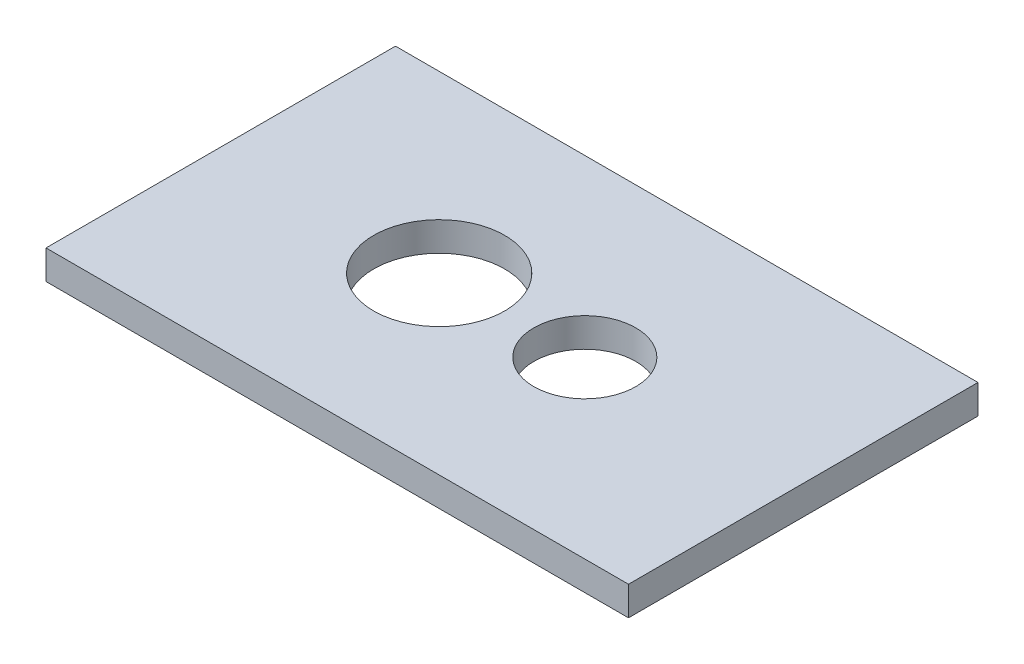
ISO-10303-21;
HEADER;
FILE_DESCRIPTION(('STEP AP214'),'2;1');
FILE_NAME('part.step','',(''),(''),'','','');
FILE_SCHEMA(('AUTOMOTIVE_DESIGN { 1 0 10303 214 1 1 1 1 }'));
ENDSEC;
DATA;
#1=APPLICATION_CONTEXT('core data for automotive mechanical design processes');
#2=APPLICATION_PROTOCOL_DEFINITION('international standard','automotive_design',2000,#1);
#3=PRODUCT_CONTEXT('',#1,'mechanical');
#4=PRODUCT('Part','Part','',(#3));
#5=PRODUCT_RELATED_PRODUCT_CATEGORY('part','',(#4));
#6=PRODUCT_DEFINITION_FORMATION('','',#4);
#7=PRODUCT_DEFINITION_CONTEXT('part definition',#1,'design');
#8=PRODUCT_DEFINITION('design','',#6,#7);
#9=PRODUCT_DEFINITION_SHAPE('','',#8);
#10=(LENGTH_UNIT() NAMED_UNIT(*) SI_UNIT(.MILLI.,.METRE.));
#11=(NAMED_UNIT(*) PLANE_ANGLE_UNIT() SI_UNIT($,.RADIAN.));
#12=(NAMED_UNIT(*) SI_UNIT($,.STERADIAN.) SOLID_ANGLE_UNIT());
#13=UNCERTAINTY_MEASURE_WITH_UNIT(LENGTH_MEASURE(1.E-05),#10,'distance_accuracy_value','');
#14=(GEOMETRIC_REPRESENTATION_CONTEXT(3) GLOBAL_UNCERTAINTY_ASSIGNED_CONTEXT((#13)) GLOBAL_UNIT_ASSIGNED_CONTEXT((#10,
#11,#12)) REPRESENTATION_CONTEXT('',''));
#15=CARTESIAN_POINT('',(0.,0.,0.));
#16=DIRECTION('',(0.,0.,1.));
#17=DIRECTION('',(1.,0.,0.));
#18=AXIS2_PLACEMENT_3D('',#15,#16,#17);
#19=CARTESIAN_POINT('',(63.5,6.35,38.1));
#20=DIRECTION('',(-1.,0.,0.));
#21=DIRECTION('',(0.,0.,1.));
#22=AXIS2_PLACEMENT_3D('',#19,#20,#21);
#23=PLANE('',#22);
#24=DIRECTION('',(0.,0.,-1.));
#25=VECTOR('',#24,1.);
#26=CARTESIAN_POINT('',(63.5,0.,38.1));
#27=LINE('',#26,#25);
#28=CARTESIAN_POINT('',(63.5,0.,38.1));
#29=VERTEX_POINT('',#28);
#30=CARTESIAN_POINT('',(63.5,0.,-38.1));
#31=VERTEX_POINT('',#30);
#32=EDGE_CURVE('E100',#29,#31,#27,.T.);
#33=ORIENTED_EDGE('',*,*,#32,.T.);
#34=DIRECTION('',(0.,-1.,0.));
#35=VECTOR('',#34,1.);
#36=CARTESIAN_POINT('',(63.5,6.35,-38.1));
#37=LINE('',#36,#35);
#38=CARTESIAN_POINT('',(63.5,6.35,-38.1));
#39=VERTEX_POINT('',#38);
#40=EDGE_CURVE('E11',#39,#31,#37,.T.);
#41=ORIENTED_EDGE('',*,*,#40,.F.);
#42=DIRECTION('',(0.,0.,-1.));
#43=VECTOR('',#42,1.);
#44=CARTESIAN_POINT('',(63.5,6.35,38.1));
#45=LINE('',#44,#43);
#46=CARTESIAN_POINT('',(63.5,6.35,38.1));
#47=VERTEX_POINT('',#46);
#48=EDGE_CURVE('E88',#47,#39,#45,.T.);
#49=ORIENTED_EDGE('',*,*,#48,.F.);
#50=DIRECTION('',(0.,-1.,0.));
#51=VECTOR('',#50,1.);
#52=CARTESIAN_POINT('',(63.5,6.35,38.1));
#53=LINE('',#52,#51);
#54=EDGE_CURVE('E96',#47,#29,#53,.T.);
#55=ORIENTED_EDGE('',*,*,#54,.T.);
#56=EDGE_LOOP('',(#33,#41,#49,#55));
#57=FACE_BOUND('',#56,.T.);
#58=ADVANCED_FACE('F37',(#57),#23,.F.);
#59=CARTESIAN_POINT('',(-63.5,6.35,-38.1));
#60=DIRECTION('',(0.,0.,1.));
#61=DIRECTION('',(1.,0.,0.));
#62=AXIS2_PLACEMENT_3D('',#59,#60,#61);
#63=PLANE('',#62);
#64=DIRECTION('',(-1.,0.,0.));
#65=VECTOR('',#64,1.);
#66=CARTESIAN_POINT('',(-63.5,0.,-38.1));
#67=LINE('',#66,#65);
#68=CARTESIAN_POINT('',(-63.5,0.,-38.1));
#69=VERTEX_POINT('',#68);
#70=EDGE_CURVE('E92',#31,#69,#67,.T.);
#71=ORIENTED_EDGE('',*,*,#70,.T.);
#72=DIRECTION('',(0.,-1.,0.));
#73=VECTOR('',#72,1.);
#74=CARTESIAN_POINT('',(-63.5,6.35,-38.1));
#75=LINE('',#74,#73);
#76=CARTESIAN_POINT('',(-63.5,6.35,-38.1));
#77=VERTEX_POINT('',#76);
#78=EDGE_CURVE('E45',#77,#69,#75,.T.);
#79=ORIENTED_EDGE('',*,*,#78,.F.);
#80=DIRECTION('',(-1.,0.,0.));
#81=VECTOR('',#80,1.);
#82=CARTESIAN_POINT('',(-63.5,6.35,-38.1));
#83=LINE('',#82,#81);
#84=EDGE_CURVE('E83',#39,#77,#83,.T.);
#85=ORIENTED_EDGE('',*,*,#84,.F.);
#86=ORIENTED_EDGE('',*,*,#40,.T.);
#87=EDGE_LOOP('',(#71,#79,#85,#86));
#88=FACE_BOUND('',#87,.T.);
#89=ADVANCED_FACE('F91',(#88),#63,.F.);
#90=CARTESIAN_POINT('',(-63.5,6.35,38.1));
#91=DIRECTION('',(1.,0.,0.));
#92=DIRECTION('',(0.,0.,-1.));
#93=AXIS2_PLACEMENT_3D('',#90,#91,#92);
#94=PLANE('',#93);
#95=DIRECTION('',(0.,0.,1.));
#96=VECTOR('',#95,1.);
#97=CARTESIAN_POINT('',(-63.5,0.,38.1));
#98=LINE('',#97,#96);
#99=CARTESIAN_POINT('',(-63.5,0.,38.1));
#100=VERTEX_POINT('',#99);
#101=EDGE_CURVE('E70',#69,#100,#98,.T.);
#102=ORIENTED_EDGE('',*,*,#101,.T.);
#103=DIRECTION('',(0.,-1.,0.));
#104=VECTOR('',#103,1.);
#105=CARTESIAN_POINT('',(-63.5,6.35,38.1));
#106=LINE('',#105,#104);
#107=CARTESIAN_POINT('',(-63.5,6.35,38.1));
#108=VERTEX_POINT('',#107);
#109=EDGE_CURVE('E93',#108,#100,#106,.T.);
#110=ORIENTED_EDGE('',*,*,#109,.F.);
#111=DIRECTION('',(0.,0.,1.));
#112=VECTOR('',#111,1.);
#113=CARTESIAN_POINT('',(-63.5,6.35,38.1));
#114=LINE('',#113,#112);
#115=EDGE_CURVE('E86',#77,#108,#114,.T.);
#116=ORIENTED_EDGE('',*,*,#115,.F.);
#117=ORIENTED_EDGE('',*,*,#78,.T.);
#118=EDGE_LOOP('',(#102,#110,#116,#117));
#119=FACE_BOUND('',#118,.T.);
#120=ADVANCED_FACE('F94',(#119),#94,.F.);
#121=CARTESIAN_POINT('',(-63.5,6.35,38.1));
#122=DIRECTION('',(0.,0.,-1.));
#123=DIRECTION('',(-1.,0.,0.));
#124=AXIS2_PLACEMENT_3D('',#121,#122,#123);
#125=PLANE('',#124);
#126=DIRECTION('',(1.,0.,0.));
#127=VECTOR('',#126,1.);
#128=CARTESIAN_POINT('',(-63.5,0.,38.1));
#129=LINE('',#128,#127);
#130=EDGE_CURVE('E76',#100,#29,#129,.T.);
#131=ORIENTED_EDGE('',*,*,#130,.T.);
#132=ORIENTED_EDGE('',*,*,#54,.F.);
#133=DIRECTION('',(1.,0.,0.));
#134=VECTOR('',#133,1.);
#135=CARTESIAN_POINT('',(-63.5,6.35,38.1));
#136=LINE('',#135,#134);
#137=EDGE_CURVE('E53',#108,#47,#136,.T.);
#138=ORIENTED_EDGE('',*,*,#137,.F.);
#139=ORIENTED_EDGE('',*,*,#109,.T.);
#140=EDGE_LOOP('',(#131,#132,#138,#139));
#141=FACE_BOUND('',#140,.T.);
#142=ADVANCED_FACE('F108',(#141),#125,.F.);
#143=CARTESIAN_POINT('',(0.,6.35,0.));
#144=DIRECTION('',(0.,-1.,0.));
#145=DIRECTION('',(0.,0.,-1.));
#146=AXIS2_PLACEMENT_3D('',#143,#144,#145);
#147=PLANE('',#146);
#148=CARTESIAN_POINT('',(15.875,6.35,0.));
#149=DIRECTION('',(0.,1.,0.));
#150=DIRECTION('',(0.,0.,1.));
#151=AXIS2_PLACEMENT_3D('',#148,#149,#150);
#152=CIRCLE('',#151,11.1125);
#153=CARTESIAN_POINT('',(15.875,6.35,11.1125));
#154=VERTEX_POINT('',#153);
#155=EDGE_CURVE('E120',#154,#154,#152,.T.);
#156=ORIENTED_EDGE('',*,*,#155,.F.);
#157=EDGE_LOOP('',(#156));
#158=FACE_BOUND('',#157,.T.);
#159=CARTESIAN_POINT('',(-15.875,6.35,0.));
#160=DIRECTION('',(0.,1.,0.));
#161=DIRECTION('',(0.,0.,1.));
#162=AXIS2_PLACEMENT_3D('',#159,#160,#161);
#163=CIRCLE('',#162,14.2875);
#164=CARTESIAN_POINT('',(-15.875,6.35,14.2875));
#165=VERTEX_POINT('',#164);
#166=EDGE_CURVE('E114',#165,#165,#163,.T.);
#167=ORIENTED_EDGE('',*,*,#166,.F.);
#168=EDGE_LOOP('',(#167));
#169=FACE_BOUND('',#168,.T.);
#170=ORIENTED_EDGE('',*,*,#48,.T.);
#171=ORIENTED_EDGE('',*,*,#84,.T.);
#172=ORIENTED_EDGE('',*,*,#115,.T.);
#173=ORIENTED_EDGE('',*,*,#137,.T.);
#174=EDGE_LOOP('',(#170,#171,#172,#173));
#175=FACE_BOUND('',#174,.T.);
#176=ADVANCED_FACE('F84',(#158,#169,#175),#147,.F.);
#177=CARTESIAN_POINT('',(0.,0.,0.));
#178=DIRECTION('',(0.,-1.,0.));
#179=DIRECTION('',(0.,0.,-1.));
#180=AXIS2_PLACEMENT_3D('',#177,#178,#179);
#181=PLANE('',#180);
#182=CARTESIAN_POINT('',(15.875,0.,0.));
#183=DIRECTION('',(0.,1.,0.));
#184=DIRECTION('',(0.,0.,1.));
#185=AXIS2_PLACEMENT_3D('',#182,#183,#184);
#186=CIRCLE('',#185,11.1125);
#187=CARTESIAN_POINT('',(15.875,0.,11.1125));
#188=VERTEX_POINT('',#187);
#189=EDGE_CURVE('E117',#188,#188,#186,.T.);
#190=ORIENTED_EDGE('',*,*,#189,.T.);
#191=EDGE_LOOP('',(#190));
#192=FACE_BOUND('',#191,.T.);
#193=CARTESIAN_POINT('',(-15.875,0.,0.));
#194=DIRECTION('',(0.,1.,0.));
#195=DIRECTION('',(0.,0.,1.));
#196=AXIS2_PLACEMENT_3D('',#193,#194,#195);
#197=CIRCLE('',#196,14.2875);
#198=CARTESIAN_POINT('',(-15.875,0.,14.2875));
#199=VERTEX_POINT('',#198);
#200=EDGE_CURVE('E103',#199,#199,#197,.T.);
#201=ORIENTED_EDGE('',*,*,#200,.T.);
#202=EDGE_LOOP('',(#201));
#203=FACE_BOUND('',#202,.T.);
#204=ORIENTED_EDGE('',*,*,#32,.F.);
#205=ORIENTED_EDGE('',*,*,#130,.F.);
#206=ORIENTED_EDGE('',*,*,#101,.F.);
#207=ORIENTED_EDGE('',*,*,#70,.F.);
#208=EDGE_LOOP('',(#204,#205,#206,#207));
#209=FACE_BOUND('',#208,.T.);
#210=ADVANCED_FACE('F111',(#192,#203,#209),#181,.T.);
#211=CARTESIAN_POINT('',(-15.875,0.,0.));
#212=DIRECTION('',(0.,1.,0.));
#213=DIRECTION('',(0.,0.,1.));
#214=AXIS2_PLACEMENT_3D('',#211,#212,#213);
#215=CYLINDRICAL_SURFACE('',#214,14.2875);
#216=ORIENTED_EDGE('',*,*,#200,.F.);
#217=EDGE_LOOP('',(#216));
#218=FACE_BOUND('',#217,.T.);
#219=ORIENTED_EDGE('',*,*,#166,.T.);
#220=EDGE_LOOP('',(#219));
#221=FACE_BOUND('',#220,.T.);
#222=ADVANCED_FACE('F131',(#218,#221),#215,.F.);
#223=CARTESIAN_POINT('',(15.875,0.,0.));
#224=DIRECTION('',(0.,1.,0.));
#225=DIRECTION('',(0.,0.,1.));
#226=AXIS2_PLACEMENT_3D('',#223,#224,#225);
#227=CYLINDRICAL_SURFACE('',#226,11.1125);
#228=ORIENTED_EDGE('',*,*,#189,.F.);
#229=EDGE_LOOP('',(#228));
#230=FACE_BOUND('',#229,.T.);
#231=ORIENTED_EDGE('',*,*,#155,.T.);
#232=EDGE_LOOP('',(#231));
#233=FACE_BOUND('',#232,.T.);
#234=ADVANCED_FACE('F128',(#230,#233),#227,.F.);
#235=CLOSED_SHELL('',(#58,#89,#120,#142,#176,#210,#222,#234));
#236=MANIFOLD_SOLID_BREP('B2',#235);
#237=ADVANCED_BREP_SHAPE_REPRESENTATION('',(#18,#236),#14);
#238=SHAPE_DEFINITION_REPRESENTATION(#9,#237);
ENDSEC;
END-ISO-10303-21;
